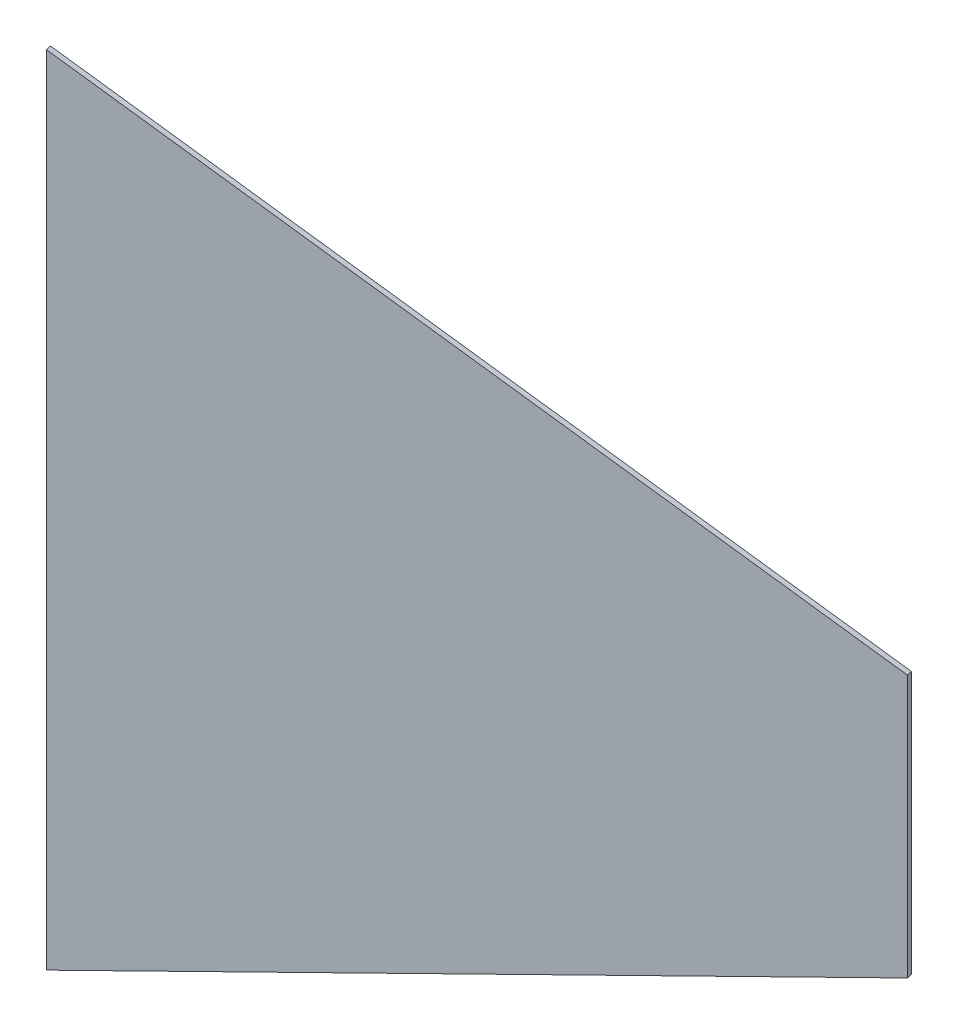
ISO-10303-21;
HEADER;
FILE_DESCRIPTION(('STEP AP214'),'2;1');
FILE_NAME('part.step','',(''),(''),'','','');
FILE_SCHEMA(('AUTOMOTIVE_DESIGN { 1 0 10303 214 1 1 1 1 }'));
ENDSEC;
DATA;
#1=APPLICATION_CONTEXT('core data for automotive mechanical design processes');
#2=APPLICATION_PROTOCOL_DEFINITION('international standard','automotive_design',2000,#1);
#3=PRODUCT_CONTEXT('',#1,'mechanical');
#4=PRODUCT('Part','Part','',(#3));
#5=PRODUCT_RELATED_PRODUCT_CATEGORY('part','',(#4));
#6=PRODUCT_DEFINITION_FORMATION('','',#4);
#7=PRODUCT_DEFINITION_CONTEXT('part definition',#1,'design');
#8=PRODUCT_DEFINITION('design','',#6,#7);
#9=PRODUCT_DEFINITION_SHAPE('','',#8);
#10=(LENGTH_UNIT() NAMED_UNIT(*) SI_UNIT(.MILLI.,.METRE.));
#11=(NAMED_UNIT(*) PLANE_ANGLE_UNIT() SI_UNIT($,.RADIAN.));
#12=(NAMED_UNIT(*) SI_UNIT($,.STERADIAN.) SOLID_ANGLE_UNIT());
#13=UNCERTAINTY_MEASURE_WITH_UNIT(LENGTH_MEASURE(1.E-05),#10,'distance_accuracy_value','');
#14=(GEOMETRIC_REPRESENTATION_CONTEXT(3) GLOBAL_UNCERTAINTY_ASSIGNED_CONTEXT((#13)) GLOBAL_UNIT_ASSIGNED_CONTEXT((#10,
#11,#12)) REPRESENTATION_CONTEXT('',''));
#15=CARTESIAN_POINT('',(0.,0.,0.));
#16=DIRECTION('',(0.,0.,1.));
#17=DIRECTION('',(1.,0.,0.));
#18=AXIS2_PLACEMENT_3D('',#15,#16,#17);
#19=CARTESIAN_POINT('',(-357.551013092979,-236.803396725,838.015063767341));
#20=DIRECTION('',(0.339186843854744,-0.93770883521261,-0.075195912921301));
#21=DIRECTION('',(0.940371233587857,0.340149883199232,0.));
#22=AXIS2_PLACEMENT_3D('',#19,#20,#21);
#23=PLANE('',#22);
#24=DIRECTION('',(0.915481391659155,0.347422135685408,-0.202957338279766));
#25=VECTOR('',#24,1.);
#26=CARTESIAN_POINT('',(-356.863817318726,-236.803396725,841.114803589947));
#27=LINE('',#26,#25);
#28=CARTESIAN_POINT('',(-356.863817318726,-236.803396725,841.114803589947));
#29=VERTEX_POINT('',#28);
#30=CARTESIAN_POINT('',(61.8258833998214,-77.9120513209207,748.293531637074));
#31=VERTEX_POINT('',#30);
#32=EDGE_CURVE('E108',#29,#31,#27,.T.);
#33=ORIENTED_EDGE('',*,*,#32,.F.);
#34=DIRECTION('',(0.216439613938103,0.,0.976296007119933));
#35=VECTOR('',#34,1.);
#36=CARTESIAN_POINT('',(-357.551013092979,-236.803396725,838.015063767341));
#37=LINE('',#36,#35);
#38=CARTESIAN_POINT('',(-357.551013092979,-236.803396725,838.015063767341));
#39=VERTEX_POINT('',#38);
#40=EDGE_CURVE('E11',#39,#29,#37,.T.);
#41=ORIENTED_EDGE('',*,*,#40,.F.);
#42=DIRECTION('',(0.915481391659155,0.347422135685408,-0.202957338279766));
#43=VECTOR('',#42,1.);
#44=CARTESIAN_POINT('',(-357.551013092979,-236.803396725,838.015063767341));
#45=LINE('',#44,#43);
#46=CARTESIAN_POINT('',(61.138687625568,-77.9120513209207,745.193791814469));
#47=VERTEX_POINT('',#46);
#48=EDGE_CURVE('E102',#39,#47,#45,.T.);
#49=ORIENTED_EDGE('',*,*,#48,.T.);
#50=DIRECTION('',(0.216439613938103,0.,0.976296007119933));
#51=VECTOR('',#50,1.);
#52=CARTESIAN_POINT('',(61.138687625568,-77.9120513209207,745.193791814469));
#53=LINE('',#52,#51);
#54=EDGE_CURVE('E47',#47,#31,#53,.T.);
#55=ORIENTED_EDGE('',*,*,#54,.T.);
#56=EDGE_LOOP('',(#33,#41,#49,#55));
#57=FACE_BOUND('',#56,.T.);
#58=ADVANCED_FACE('F44',(#57),#23,.T.);
#59=CARTESIAN_POINT('',(-357.55101309298,236.803396725,838.015063767341));
#60=DIRECTION('',(-0.976296007119933,0.,0.216439613938103));
#61=DIRECTION('',(0.216439613938103,0.,0.976296007119933));
#62=AXIS2_PLACEMENT_3D('',#59,#60,#61);
#63=PLANE('',#62);
#64=DIRECTION('',(0.,-1.,0.));
#65=VECTOR('',#64,1.);
#66=CARTESIAN_POINT('',(-356.863817318726,236.803396725,841.114803589947));
#67=LINE('',#66,#65);
#68=CARTESIAN_POINT('',(-356.863817318726,236.803396725,841.114803589947));
#69=VERTEX_POINT('',#68);
#70=EDGE_CURVE('E104',#69,#29,#67,.T.);
#71=ORIENTED_EDGE('',*,*,#70,.F.);
#72=DIRECTION('',(0.216439613938103,0.,0.976296007119933));
#73=VECTOR('',#72,1.);
#74=CARTESIAN_POINT('',(-357.55101309298,236.803396725,838.015063767341));
#75=LINE('',#74,#73);
#76=CARTESIAN_POINT('',(-357.55101309298,236.803396725,838.015063767341));
#77=VERTEX_POINT('',#76);
#78=EDGE_CURVE('E53',#77,#69,#75,.T.);
#79=ORIENTED_EDGE('',*,*,#78,.F.);
#80=DIRECTION('',(0.,-1.,0.));
#81=VECTOR('',#80,1.);
#82=CARTESIAN_POINT('',(-357.55101309298,236.803396725,838.015063767341));
#83=LINE('',#82,#81);
#84=EDGE_CURVE('E99',#77,#39,#83,.T.);
#85=ORIENTED_EDGE('',*,*,#84,.T.);
#86=ORIENTED_EDGE('',*,*,#40,.T.);
#87=EDGE_LOOP('',(#71,#79,#85,#86));
#88=FACE_BOUND('',#87,.T.);
#89=ADVANCED_FACE('F118',(#88),#63,.T.);
#90=CARTESIAN_POINT('',(-357.55101309298,236.803396725,838.015063767341));
#91=DIRECTION('',(0.339186843854743,0.93770883521261,-0.0751959129213009));
#92=DIRECTION('',(-0.940371233587858,0.340149883199232,0.));
#93=AXIS2_PLACEMENT_3D('',#90,#91,#92);
#94=PLANE('',#93);
#95=DIRECTION('',(-0.915481391659155,0.347422135685408,0.202957338279766));
#96=VECTOR('',#95,1.);
#97=CARTESIAN_POINT('',(-356.863817318726,236.803396725,841.114803589947));
#98=LINE('',#97,#96);
#99=CARTESIAN_POINT('',(61.8258833998213,77.9120513209206,748.293531637075));
#100=VERTEX_POINT('',#99);
#101=EDGE_CURVE('E94',#100,#69,#98,.T.);
#102=ORIENTED_EDGE('',*,*,#101,.F.);
#103=DIRECTION('',(0.216439613938103,0.,0.976296007119933));
#104=VECTOR('',#103,1.);
#105=CARTESIAN_POINT('',(61.1386876255679,77.9120513209206,745.193791814469));
#106=LINE('',#105,#104);
#107=CARTESIAN_POINT('',(61.1386876255679,77.9120513209206,745.193791814469));
#108=VERTEX_POINT('',#107);
#109=EDGE_CURVE('E89',#108,#100,#106,.T.);
#110=ORIENTED_EDGE('',*,*,#109,.F.);
#111=DIRECTION('',(-0.915481391659155,0.347422135685408,0.202957338279766));
#112=VECTOR('',#111,1.);
#113=CARTESIAN_POINT('',(-357.55101309298,236.803396725,838.015063767341));
#114=LINE('',#113,#112);
#115=EDGE_CURVE('E92',#108,#77,#114,.T.);
#116=ORIENTED_EDGE('',*,*,#115,.T.);
#117=ORIENTED_EDGE('',*,*,#78,.T.);
#118=EDGE_LOOP('',(#102,#110,#116,#117));
#119=FACE_BOUND('',#118,.T.);
#120=ADVANCED_FACE('F91',(#119),#94,.T.);
#121=CARTESIAN_POINT('',(61.138687625568,-77.9120513209207,745.193791814469));
#122=DIRECTION('',(0.976296007119933,0.,-0.216439613938103));
#123=DIRECTION('',(-0.216439613938103,0.,-0.976296007119933));
#124=AXIS2_PLACEMENT_3D('',#121,#122,#123);
#125=PLANE('',#124);
#126=DIRECTION('',(0.,1.,0.));
#127=VECTOR('',#126,1.);
#128=CARTESIAN_POINT('',(61.8258833998214,-77.9120513209207,748.293531637074));
#129=LINE('',#128,#127);
#130=EDGE_CURVE('E111',#31,#100,#129,.T.);
#131=ORIENTED_EDGE('',*,*,#130,.F.);
#132=ORIENTED_EDGE('',*,*,#54,.F.);
#133=DIRECTION('',(0.,1.,0.));
#134=VECTOR('',#133,1.);
#135=CARTESIAN_POINT('',(61.138687625568,-77.9120513209207,745.193791814469));
#136=LINE('',#135,#134);
#137=EDGE_CURVE('E98',#47,#108,#136,.T.);
#138=ORIENTED_EDGE('',*,*,#137,.T.);
#139=ORIENTED_EDGE('',*,*,#109,.T.);
#140=EDGE_LOOP('',(#131,#132,#138,#139));
#141=FACE_BOUND('',#140,.T.);
#142=ADVANCED_FACE('F101',(#141),#125,.T.);
#143=CARTESIAN_POINT('',(160.330361948953,-4.02757467642093E-13,723.203527038358));
#144=DIRECTION('',(0.216439613938104,0.,0.976296007119933));
#145=DIRECTION('',(0.976296007119933,0.,-0.216439613938104));
#146=AXIS2_PLACEMENT_3D('',#143,#144,#145);
#147=PLANE('',#146);
#148=ORIENTED_EDGE('',*,*,#48,.F.);
#149=ORIENTED_EDGE('',*,*,#84,.F.);
#150=ORIENTED_EDGE('',*,*,#115,.F.);
#151=ORIENTED_EDGE('',*,*,#137,.F.);
#152=EDGE_LOOP('',(#148,#149,#150,#151));
#153=FACE_BOUND('',#152,.T.);
#154=ADVANCED_FACE('F97',(#153),#147,.F.);
#155=CARTESIAN_POINT('',(161.017557723207,-4.02757467642093E-13,726.303266860963));
#156=DIRECTION('',(0.216439613938104,0.,0.976296007119933));
#157=DIRECTION('',(0.976296007119933,0.,-0.216439613938104));
#158=AXIS2_PLACEMENT_3D('',#155,#156,#157);
#159=PLANE('',#158);
#160=ORIENTED_EDGE('',*,*,#32,.T.);
#161=ORIENTED_EDGE('',*,*,#130,.T.);
#162=ORIENTED_EDGE('',*,*,#101,.T.);
#163=ORIENTED_EDGE('',*,*,#70,.T.);
#164=EDGE_LOOP('',(#160,#161,#162,#163));
#165=FACE_BOUND('',#164,.T.);
#166=ADVANCED_FACE('F117',(#165),#159,.T.);
#167=CLOSED_SHELL('',(#58,#89,#120,#142,#154,#166));
#168=MANIFOLD_SOLID_BREP('B2',#167);
#169=ADVANCED_BREP_SHAPE_REPRESENTATION('',(#18,#168),#14);
#170=SHAPE_DEFINITION_REPRESENTATION(#9,#169);
ENDSEC;
END-ISO-10303-21;
